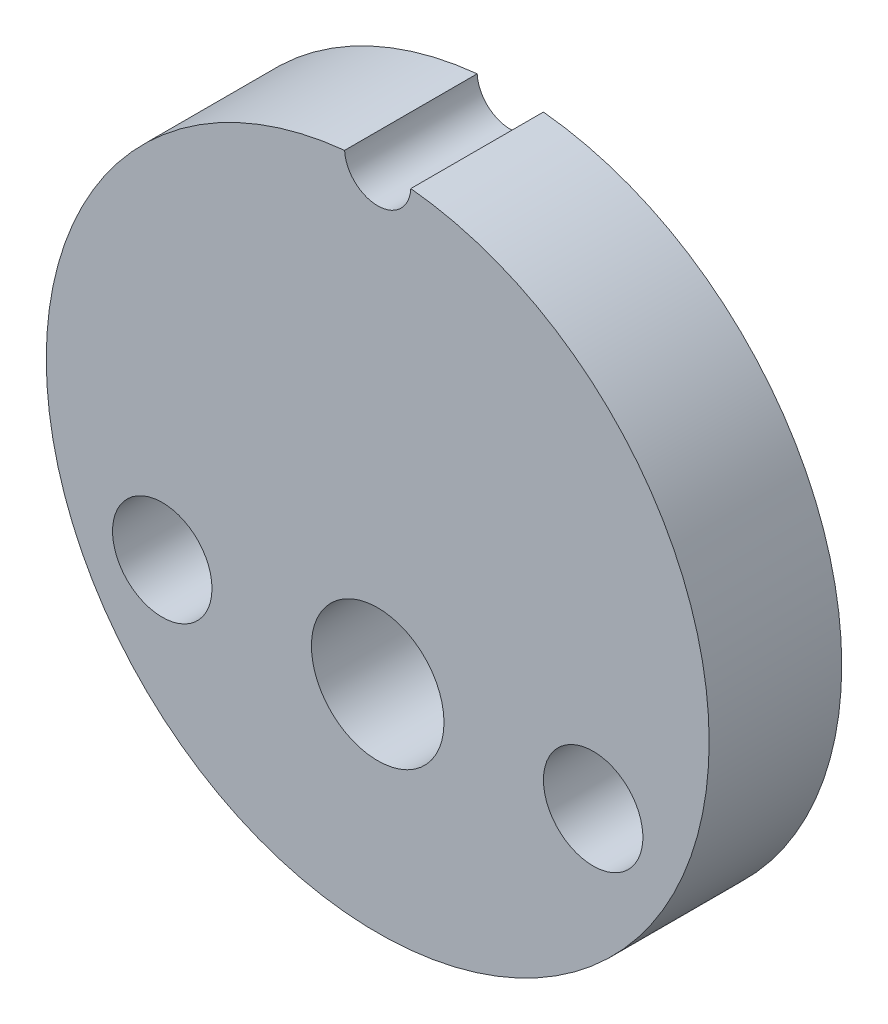
ISO-10303-21;
HEADER;
FILE_DESCRIPTION(('STEP AP214'),'2;1');
FILE_NAME('part.step','',(''),(''),'','','');
FILE_SCHEMA(('AUTOMOTIVE_DESIGN { 1 0 10303 214 1 1 1 1 }'));
ENDSEC;
DATA;
#1=APPLICATION_CONTEXT('core data for automotive mechanical design processes');
#2=APPLICATION_PROTOCOL_DEFINITION('international standard','automotive_design',2000,#1);
#3=PRODUCT_CONTEXT('',#1,'mechanical');
#4=PRODUCT('Part','Part','',(#3));
#5=PRODUCT_RELATED_PRODUCT_CATEGORY('part','',(#4));
#6=PRODUCT_DEFINITION_FORMATION('','',#4);
#7=PRODUCT_DEFINITION_CONTEXT('part definition',#1,'design');
#8=PRODUCT_DEFINITION('design','',#6,#7);
#9=PRODUCT_DEFINITION_SHAPE('','',#8);
#10=(LENGTH_UNIT() NAMED_UNIT(*) SI_UNIT(.MILLI.,.METRE.));
#11=(NAMED_UNIT(*) PLANE_ANGLE_UNIT() SI_UNIT($,.RADIAN.));
#12=(NAMED_UNIT(*) SI_UNIT($,.STERADIAN.) SOLID_ANGLE_UNIT());
#13=UNCERTAINTY_MEASURE_WITH_UNIT(LENGTH_MEASURE(1.E-05),#10,'distance_accuracy_value','');
#14=(GEOMETRIC_REPRESENTATION_CONTEXT(3) GLOBAL_UNCERTAINTY_ASSIGNED_CONTEXT((#13)) GLOBAL_UNIT_ASSIGNED_CONTEXT((#10,
#11,#12)) REPRESENTATION_CONTEXT('',''));
#15=CARTESIAN_POINT('',(0.,0.,0.));
#16=DIRECTION('',(0.,0.,1.));
#17=DIRECTION('',(1.,0.,0.));
#18=AXIS2_PLACEMENT_3D('',#15,#16,#17);
#19=CARTESIAN_POINT('',(-0.589945762939997,5.34282561400124,4.));
#20=DIRECTION('',(0.,0.,1.));
#21=DIRECTION('',(1.,0.,0.));
#22=AXIS2_PLACEMENT_3D('',#19,#20,#21);
#23=PLANE('',#22);
#24=CARTESIAN_POINT('',(-0.589945762939997,15.3428256140012,4.));
#25=DIRECTION('',(0.,0.,1.));
#26=DIRECTION('',(1.,0.,0.));
#27=AXIS2_PLACEMENT_3D('',#24,#25,#26);
#28=CIRCLE('',#27,1.);
#29=CARTESIAN_POINT('',(-1.58869498071191,15.2928256140012,4.));
#30=VERTEX_POINT('',#29);
#31=CARTESIAN_POINT('',(0.408803454831912,15.2928256140012,4.));
#32=VERTEX_POINT('',#31);
#33=EDGE_CURVE('E62',#30,#32,#28,.T.);
#34=ORIENTED_EDGE('',*,*,#33,.F.);
#35=CARTESIAN_POINT('',(-0.589945762939997,5.34282561400124,4.));
#36=DIRECTION('',(0.,0.,1.));
#37=DIRECTION('',(1.,0.,0.));
#38=AXIS2_PLACEMENT_3D('',#35,#36,#37);
#39=CIRCLE('',#38,10.);
#40=EDGE_CURVE('E67',#30,#32,#39,.T.);
#41=ORIENTED_EDGE('',*,*,#40,.T.);
#42=EDGE_LOOP('',(#34,#41));
#43=FACE_BOUND('',#42,.T.);
#44=CARTESIAN_POINT('',(5.91005423706,1.84282561400124,4.));
#45=DIRECTION('',(0.,0.,1.));
#46=DIRECTION('',(-1.,0.,0.));
#47=AXIS2_PLACEMENT_3D('',#44,#45,#46);
#48=CIRCLE('',#47,1.5);
#49=CARTESIAN_POINT('',(4.41005423706,1.84282561400124,4.));
#50=VERTEX_POINT('',#49);
#51=EDGE_CURVE('E80',#50,#50,#48,.T.);
#52=ORIENTED_EDGE('',*,*,#51,.F.);
#53=EDGE_LOOP('',(#52));
#54=FACE_BOUND('',#53,.T.);
#55=CARTESIAN_POINT('',(-7.08994576294,1.84282561400124,4.));
#56=DIRECTION('',(0.,0.,1.));
#57=DIRECTION('',(1.,0.,0.));
#58=AXIS2_PLACEMENT_3D('',#55,#56,#57);
#59=CIRCLE('',#58,1.5);
#60=CARTESIAN_POINT('',(-5.58994576294,1.84282561400124,4.));
#61=VERTEX_POINT('',#60);
#62=EDGE_CURVE('E74',#61,#61,#59,.T.);
#63=ORIENTED_EDGE('',*,*,#62,.F.);
#64=EDGE_LOOP('',(#63));
#65=FACE_BOUND('',#64,.T.);
#66=CARTESIAN_POINT('',(-0.589945762939997,1.84282561400124,4.));
#67=DIRECTION('',(0.,0.,1.));
#68=DIRECTION('',(1.,0.,0.));
#69=AXIS2_PLACEMENT_3D('',#66,#67,#68);
#70=CIRCLE('',#69,2.);
#71=CARTESIAN_POINT('',(1.41005423706,1.84282561400124,4.));
#72=VERTEX_POINT('',#71);
#73=EDGE_CURVE('E86',#72,#72,#70,.T.);
#74=ORIENTED_EDGE('',*,*,#73,.F.);
#75=EDGE_LOOP('',(#74));
#76=FACE_BOUND('',#75,.T.);
#77=ADVANCED_FACE('F38',(#43,#54,#65,#76),#23,.T.);
#78=CARTESIAN_POINT('',(-0.589945762939997,5.34282561400124,0.));
#79=DIRECTION('',(0.,0.,1.));
#80=DIRECTION('',(1.,0.,0.));
#81=AXIS2_PLACEMENT_3D('',#78,#79,#80);
#82=PLANE('',#81);
#83=CARTESIAN_POINT('',(-0.589945762939997,5.34282561400124,0.));
#84=DIRECTION('',(0.,0.,1.));
#85=DIRECTION('',(1.,0.,0.));
#86=AXIS2_PLACEMENT_3D('',#83,#84,#85);
#87=CIRCLE('',#86,10.);
#88=CARTESIAN_POINT('',(-1.58869498071191,15.2928256140012,0.));
#89=VERTEX_POINT('',#88);
#90=CARTESIAN_POINT('',(0.408803454831911,15.2928256140012,0.));
#91=VERTEX_POINT('',#90);
#92=EDGE_CURVE('E72',#89,#91,#87,.T.);
#93=ORIENTED_EDGE('',*,*,#92,.F.);
#94=CARTESIAN_POINT('',(-0.589945762939997,15.3428256140012,0.));
#95=DIRECTION('',(0.,0.,1.));
#96=DIRECTION('',(1.,0.,0.));
#97=AXIS2_PLACEMENT_3D('',#94,#95,#96);
#98=CIRCLE('',#97,1.);
#99=EDGE_CURVE('E53',#89,#91,#98,.T.);
#100=ORIENTED_EDGE('',*,*,#99,.T.);
#101=EDGE_LOOP('',(#93,#100));
#102=FACE_BOUND('',#101,.T.);
#103=CARTESIAN_POINT('',(-7.08994576294,1.84282561400124,0.));
#104=DIRECTION('',(0.,0.,1.));
#105=DIRECTION('',(1.,0.,0.));
#106=AXIS2_PLACEMENT_3D('',#103,#104,#105);
#107=CIRCLE('',#106,1.5);
#108=CARTESIAN_POINT('',(-5.58994576294,1.84282561400124,0.));
#109=VERTEX_POINT('',#108);
#110=EDGE_CURVE('E77',#109,#109,#107,.T.);
#111=ORIENTED_EDGE('',*,*,#110,.T.);
#112=EDGE_LOOP('',(#111));
#113=FACE_BOUND('',#112,.T.);
#114=CARTESIAN_POINT('',(5.91005423706,1.84282561400124,0.));
#115=DIRECTION('',(0.,0.,1.));
#116=DIRECTION('',(-1.,0.,0.));
#117=AXIS2_PLACEMENT_3D('',#114,#115,#116);
#118=CIRCLE('',#117,1.5);
#119=CARTESIAN_POINT('',(4.41005423706,1.84282561400124,0.));
#120=VERTEX_POINT('',#119);
#121=EDGE_CURVE('E83',#120,#120,#118,.T.);
#122=ORIENTED_EDGE('',*,*,#121,.T.);
#123=EDGE_LOOP('',(#122));
#124=FACE_BOUND('',#123,.T.);
#125=CARTESIAN_POINT('',(-0.589945762939997,1.84282561400124,0.));
#126=DIRECTION('',(0.,0.,1.));
#127=DIRECTION('',(1.,0.,0.));
#128=AXIS2_PLACEMENT_3D('',#125,#126,#127);
#129=CIRCLE('',#128,2.);
#130=CARTESIAN_POINT('',(1.41005423706,1.84282561400124,0.));
#131=VERTEX_POINT('',#130);
#132=EDGE_CURVE('E89',#131,#131,#129,.T.);
#133=ORIENTED_EDGE('',*,*,#132,.T.);
#134=EDGE_LOOP('',(#133));
#135=FACE_BOUND('',#134,.T.);
#136=ADVANCED_FACE('F95',(#102,#113,#124,#135),#82,.F.);
#137=CARTESIAN_POINT('',(-0.589945762939997,5.34282561400124,4.));
#138=DIRECTION('',(0.,0.,-1.));
#139=DIRECTION('',(-1.,0.,0.));
#140=AXIS2_PLACEMENT_3D('',#137,#138,#139);
#141=CYLINDRICAL_SURFACE('',#140,10.);
#142=ORIENTED_EDGE('',*,*,#92,.T.);
#143=DIRECTION('',(0.,0.,1.));
#144=VECTOR('',#143,1.);
#145=CARTESIAN_POINT('',(0.408803454831912,15.2928256140012,-1.));
#146=LINE('',#145,#144);
#147=EDGE_CURVE('E11',#91,#32,#146,.T.);
#148=ORIENTED_EDGE('',*,*,#147,.T.);
#149=ORIENTED_EDGE('',*,*,#40,.F.);
#150=DIRECTION('',(0.,0.,1.));
#151=VECTOR('',#150,1.);
#152=CARTESIAN_POINT('',(-1.58869498071191,15.2928256140012,-1.));
#153=LINE('',#152,#151);
#154=EDGE_CURVE('E46',#30,#89,#153,.F.);
#155=ORIENTED_EDGE('',*,*,#154,.T.);
#156=EDGE_LOOP('',(#142,#148,#149,#155));
#157=FACE_BOUND('',#156,.T.);
#158=ADVANCED_FACE('F40',(#157),#141,.T.);
#159=CARTESIAN_POINT('',(-7.08994576294,1.84282561400124,4.));
#160=DIRECTION('',(0.,0.,-1.));
#161=DIRECTION('',(-1.,0.,0.));
#162=AXIS2_PLACEMENT_3D('',#159,#160,#161);
#163=CYLINDRICAL_SURFACE('',#162,1.5);
#164=ORIENTED_EDGE('',*,*,#62,.T.);
#165=EDGE_LOOP('',(#164));
#166=FACE_BOUND('',#165,.T.);
#167=ORIENTED_EDGE('',*,*,#110,.F.);
#168=EDGE_LOOP('',(#167));
#169=FACE_BOUND('',#168,.T.);
#170=ADVANCED_FACE('F114',(#166,#169),#163,.F.);
#171=CARTESIAN_POINT('',(5.91005423706,1.84282561400124,4.));
#172=DIRECTION('',(0.,0.,-1.));
#173=DIRECTION('',(-1.,0.,0.));
#174=AXIS2_PLACEMENT_3D('',#171,#172,#173);
#175=CYLINDRICAL_SURFACE('',#174,1.5);
#176=ORIENTED_EDGE('',*,*,#51,.T.);
#177=EDGE_LOOP('',(#176));
#178=FACE_BOUND('',#177,.T.);
#179=ORIENTED_EDGE('',*,*,#121,.F.);
#180=EDGE_LOOP('',(#179));
#181=FACE_BOUND('',#180,.T.);
#182=ADVANCED_FACE('F106',(#178,#181),#175,.F.);
#183=CARTESIAN_POINT('',(-0.589945762939997,1.84282561400124,4.));
#184=DIRECTION('',(0.,0.,-1.));
#185=DIRECTION('',(-1.,0.,0.));
#186=AXIS2_PLACEMENT_3D('',#183,#184,#185);
#187=CYLINDRICAL_SURFACE('',#186,2.);
#188=ORIENTED_EDGE('',*,*,#73,.T.);
#189=EDGE_LOOP('',(#188));
#190=FACE_BOUND('',#189,.T.);
#191=ORIENTED_EDGE('',*,*,#132,.F.);
#192=EDGE_LOOP('',(#191));
#193=FACE_BOUND('',#192,.T.);
#194=ADVANCED_FACE('F104',(#190,#193),#187,.F.);
#195=CARTESIAN_POINT('',(-0.589945762939997,15.3428256140012,-6.));
#196=DIRECTION('',(0.,0.,1.));
#197=DIRECTION('',(1.,0.,0.));
#198=AXIS2_PLACEMENT_3D('',#195,#196,#197);
#199=CYLINDRICAL_SURFACE('',#198,1.);
#200=ORIENTED_EDGE('',*,*,#99,.F.);
#201=ORIENTED_EDGE('',*,*,#154,.F.);
#202=ORIENTED_EDGE('',*,*,#33,.T.);
#203=ORIENTED_EDGE('',*,*,#147,.F.);
#204=EDGE_LOOP('',(#200,#201,#202,#203));
#205=FACE_BOUND('',#204,.T.);
#206=ADVANCED_FACE('F61',(#205),#199,.F.);
#207=CLOSED_SHELL('',(#77,#136,#158,#170,#182,#194,#206));
#208=MANIFOLD_SOLID_BREP('B2',#207);
#209=ADVANCED_BREP_SHAPE_REPRESENTATION('',(#18,#208),#14);
#210=SHAPE_DEFINITION_REPRESENTATION(#9,#209);
ENDSEC;
END-ISO-10303-21;
